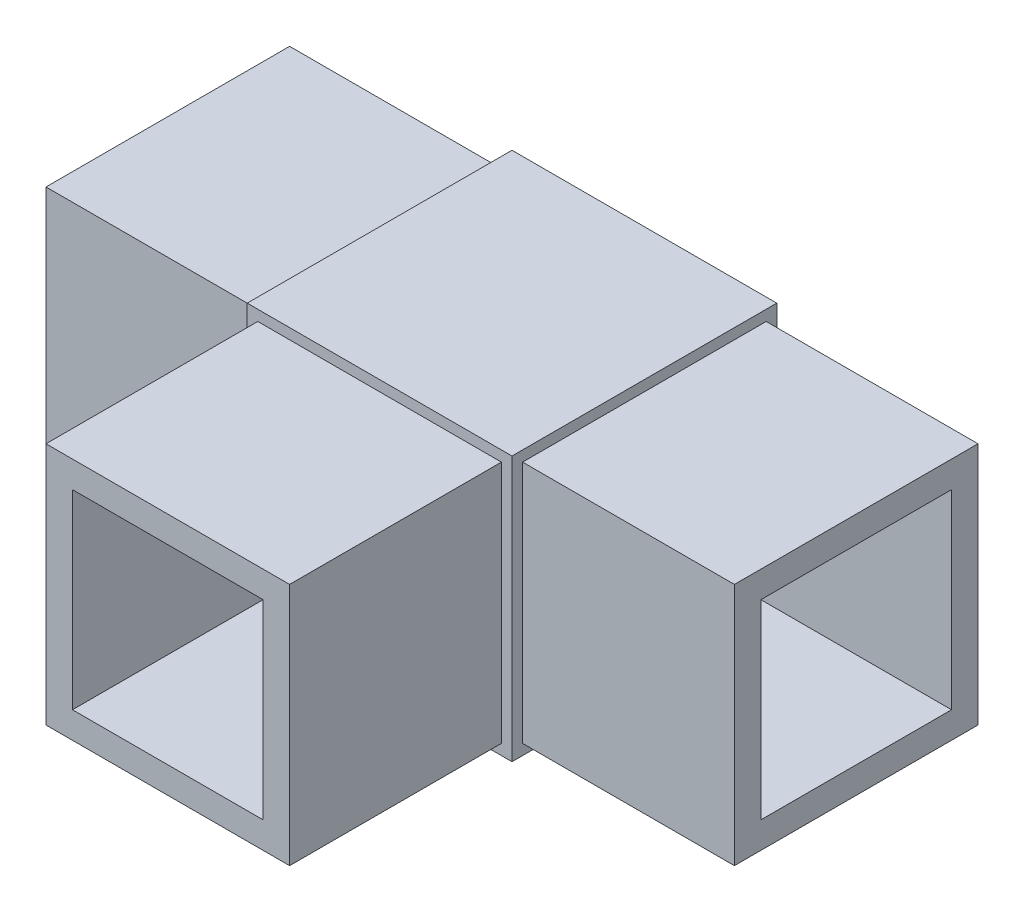
ISO-10303-21;
HEADER;
FILE_DESCRIPTION(('STEP AP214'),'2;1');
FILE_NAME('part.step','',(''),(''),'','','');
FILE_SCHEMA(('AUTOMOTIVE_DESIGN { 1 0 10303 214 1 1 1 1 }'));
ENDSEC;
DATA;
#1=APPLICATION_CONTEXT('core data for automotive mechanical design processes');
#2=APPLICATION_PROTOCOL_DEFINITION('international standard','automotive_design',2000,#1);
#3=PRODUCT_CONTEXT('',#1,'mechanical');
#4=PRODUCT('Part','Part','',(#3));
#5=PRODUCT_RELATED_PRODUCT_CATEGORY('part','',(#4));
#6=PRODUCT_DEFINITION_FORMATION('','',#4);
#7=PRODUCT_DEFINITION_CONTEXT('part definition',#1,'design');
#8=PRODUCT_DEFINITION('design','',#6,#7);
#9=PRODUCT_DEFINITION_SHAPE('','',#8);
#10=(LENGTH_UNIT() NAMED_UNIT(*) SI_UNIT(.MILLI.,.METRE.));
#11=(NAMED_UNIT(*) PLANE_ANGLE_UNIT() SI_UNIT($,.RADIAN.));
#12=(NAMED_UNIT(*) SI_UNIT($,.STERADIAN.) SOLID_ANGLE_UNIT());
#13=UNCERTAINTY_MEASURE_WITH_UNIT(LENGTH_MEASURE(1.E-05),#10,'distance_accuracy_value','');
#14=(GEOMETRIC_REPRESENTATION_CONTEXT(3) GLOBAL_UNCERTAINTY_ASSIGNED_CONTEXT((#13)) GLOBAL_UNIT_ASSIGNED_CONTEXT((#10,
#11,#12)) REPRESENTATION_CONTEXT('',''));
#15=CARTESIAN_POINT('',(0.,0.,0.));
#16=DIRECTION('',(0.,0.,1.));
#17=DIRECTION('',(1.,0.,0.));
#18=AXIS2_PLACEMENT_3D('',#15,#16,#17);
#19=CARTESIAN_POINT('',(109.11923894657,-205.969874038202,21.5));
#20=DIRECTION('',(0.,0.,1.));
#21=DIRECTION('',(1.,0.,0.));
#22=AXIS2_PLACEMENT_3D('',#19,#20,#21);
#23=PLANE('',#22);
#24=DIRECTION('',(1.,0.,0.));
#25=VECTOR('',#24,1.);
#26=CARTESIAN_POINT('',(109.11923894657,-187.969874038202,21.5));
#27=LINE('',#26,#25);
#28=CARTESIAN_POINT('',(109.11923894657,-187.969874038202,21.5));
#29=VERTEX_POINT('',#28);
#30=CARTESIAN_POINT('',(132.61923894657,-187.969874038202,21.5));
#31=VERTEX_POINT('',#30);
#32=EDGE_CURVE('E261',#29,#31,#27,.T.);
#33=ORIENTED_EDGE('',*,*,#32,.T.);
#34=DIRECTION('',(0.,-1.,0.));
#35=VECTOR('',#34,1.);
#36=CARTESIAN_POINT('',(132.61923894657,-205.969874038202,21.5));
#37=LINE('',#36,#35);
#38=CARTESIAN_POINT('',(132.61923894657,-205.969874038202,21.5));
#39=VERTEX_POINT('',#38);
#40=EDGE_CURVE('E230',#31,#39,#37,.T.);
#41=ORIENTED_EDGE('',*,*,#40,.T.);
#42=DIRECTION('',(1.,0.,0.));
#43=VECTOR('',#42,1.);
#44=CARTESIAN_POINT('',(109.11923894657,-205.969874038202,21.5));
#45=LINE('',#44,#43);
#46=CARTESIAN_POINT('',(109.11923894657,-205.969874038202,21.5));
#47=VERTEX_POINT('',#46);
#48=EDGE_CURVE('E202',#47,#39,#45,.T.);
#49=ORIENTED_EDGE('',*,*,#48,.F.);
#50=DIRECTION('',(0.,-1.,0.));
#51=VECTOR('',#50,1.);
#52=CARTESIAN_POINT('',(109.11923894657,-205.969874038202,21.5));
#53=LINE('',#52,#51);
#54=EDGE_CURVE('E240',#29,#47,#53,.T.);
#55=ORIENTED_EDGE('',*,*,#54,.F.);
#56=EDGE_LOOP('',(#33,#41,#49,#55));
#57=FACE_BOUND('',#56,.T.);
#58=ADVANCED_FACE('F35',(#57),#23,.F.);
#59=CARTESIAN_POINT('',(109.11923894657,-209.469874038202,25.));
#60=DIRECTION('',(0.,1.,0.));
#61=DIRECTION('',(-1.,0.,0.));
#62=AXIS2_PLACEMENT_3D('',#59,#60,#61);
#63=PLANE('',#62);
#64=DIRECTION('',(0.,0.,-1.));
#65=VECTOR('',#64,1.);
#66=CARTESIAN_POINT('',(154.11923894657,-209.469874038202,0.));
#67=LINE('',#66,#65);
#68=CARTESIAN_POINT('',(154.11923894657,-209.469874038202,25.));
#69=VERTEX_POINT('',#68);
#70=CARTESIAN_POINT('',(154.11923894657,-209.469874038202,0.));
#71=VERTEX_POINT('',#70);
#72=EDGE_CURVE('E304',#69,#71,#67,.T.);
#73=ORIENTED_EDGE('',*,*,#72,.F.);
#74=DIRECTION('',(1.,0.,0.));
#75=VECTOR('',#74,1.);
#76=CARTESIAN_POINT('',(109.11923894657,-209.469874038202,25.));
#77=LINE('',#76,#75);
#78=CARTESIAN_POINT('',(129.11923894657,-209.469874038202,25.));
#79=VERTEX_POINT('',#78);
#80=EDGE_CURVE('E11',#79,#69,#77,.T.);
#81=ORIENTED_EDGE('',*,*,#80,.F.);
#82=DIRECTION('',(0.,0.,1.));
#83=VECTOR('',#82,1.);
#84=CARTESIAN_POINT('',(129.11923894657,-209.469874038202,0.));
#85=LINE('',#84,#83);
#86=CARTESIAN_POINT('',(129.11923894657,-209.469874038202,0.));
#87=VERTEX_POINT('',#86);
#88=EDGE_CURVE('E341',#87,#79,#85,.T.);
#89=ORIENTED_EDGE('',*,*,#88,.F.);
#90=DIRECTION('',(1.,0.,0.));
#91=VECTOR('',#90,1.);
#92=CARTESIAN_POINT('',(109.11923894657,-209.469874038202,0.));
#93=LINE('',#92,#91);
#94=EDGE_CURVE('E39',#87,#71,#93,.T.);
#95=ORIENTED_EDGE('',*,*,#94,.T.);
#96=EDGE_LOOP('',(#73,#81,#89,#95));
#97=FACE_BOUND('',#96,.T.);
#98=ADVANCED_FACE('F392',(#97),#63,.F.);
#99=CARTESIAN_POINT('',(109.11923894657,-184.469874038202,25.));
#100=DIRECTION('',(0.,1.,0.));
#101=DIRECTION('',(0.,0.,1.));
#102=AXIS2_PLACEMENT_3D('',#99,#100,#101);
#103=PLANE('',#102);
#104=DIRECTION('',(1.,0.,0.));
#105=VECTOR('',#104,1.);
#106=CARTESIAN_POINT('',(109.11923894657,-184.469874038202,25.));
#107=LINE('',#106,#105);
#108=CARTESIAN_POINT('',(129.11923894657,-184.469874038202,25.));
#109=VERTEX_POINT('',#108);
#110=CARTESIAN_POINT('',(154.11923894657,-184.469874038202,25.));
#111=VERTEX_POINT('',#110);
#112=EDGE_CURVE('E44',#109,#111,#107,.T.);
#113=ORIENTED_EDGE('',*,*,#112,.T.);
#114=DIRECTION('',(0.,0.,1.));
#115=VECTOR('',#114,1.);
#116=CARTESIAN_POINT('',(154.11923894657,-184.469874038202,0.));
#117=LINE('',#116,#115);
#118=CARTESIAN_POINT('',(154.11923894657,-184.469874038202,0.));
#119=VERTEX_POINT('',#118);
#120=EDGE_CURVE('E300',#119,#111,#117,.T.);
#121=ORIENTED_EDGE('',*,*,#120,.F.);
#122=DIRECTION('',(1.,0.,0.));
#123=VECTOR('',#122,1.);
#124=CARTESIAN_POINT('',(109.11923894657,-184.469874038202,0.));
#125=LINE('',#124,#123);
#126=CARTESIAN_POINT('',(129.11923894657,-184.469874038202,0.));
#127=VERTEX_POINT('',#126);
#128=EDGE_CURVE('E374',#127,#119,#125,.T.);
#129=ORIENTED_EDGE('',*,*,#128,.F.);
#130=DIRECTION('',(0.,0.,-1.));
#131=VECTOR('',#130,1.);
#132=CARTESIAN_POINT('',(129.11923894657,-184.469874038202,0.));
#133=LINE('',#132,#131);
#134=EDGE_CURVE('E345',#109,#127,#133,.T.);
#135=ORIENTED_EDGE('',*,*,#134,.F.);
#136=EDGE_LOOP('',(#113,#121,#129,#135));
#137=FACE_BOUND('',#136,.T.);
#138=ADVANCED_FACE('F400',(#137),#103,.T.);
#139=CARTESIAN_POINT('',(0.,0.,25.));
#140=DIRECTION('',(0.,0.,-1.));
#141=DIRECTION('',(-1.,0.,0.));
#142=AXIS2_PLACEMENT_3D('',#139,#140,#141);
#143=PLANE('',#142);
#144=DIRECTION('',(0.,-1.,0.));
#145=VECTOR('',#144,1.);
#146=CARTESIAN_POINT('',(130.11923894657,-208.469874038202,25.));
#147=LINE('',#146,#145);
#148=CARTESIAN_POINT('',(130.11923894657,-185.469874038202,25.));
#149=VERTEX_POINT('',#148);
#150=CARTESIAN_POINT('',(130.11923894657,-208.469874038202,25.));
#151=VERTEX_POINT('',#150);
#152=EDGE_CURVE('E348',#149,#151,#147,.T.);
#153=ORIENTED_EDGE('',*,*,#152,.F.);
#154=DIRECTION('',(-1.,0.,0.));
#155=VECTOR('',#154,1.);
#156=CARTESIAN_POINT('',(130.11923894657,-185.469874038202,25.));
#157=LINE('',#156,#155);
#158=CARTESIAN_POINT('',(153.11923894657,-185.469874038202,25.));
#159=VERTEX_POINT('',#158);
#160=EDGE_CURVE('E358',#159,#149,#157,.T.);
#161=ORIENTED_EDGE('',*,*,#160,.F.);
#162=DIRECTION('',(0.,1.,0.));
#163=VECTOR('',#162,1.);
#164=CARTESIAN_POINT('',(153.11923894657,-208.469874038202,25.));
#165=LINE('',#164,#163);
#166=CARTESIAN_POINT('',(153.11923894657,-208.469874038202,25.));
#167=VERTEX_POINT('',#166);
#168=EDGE_CURVE('E355',#167,#159,#165,.T.);
#169=ORIENTED_EDGE('',*,*,#168,.F.);
#170=DIRECTION('',(1.,0.,0.));
#171=VECTOR('',#170,1.);
#172=CARTESIAN_POINT('',(130.11923894657,-208.469874038202,25.));
#173=LINE('',#172,#171);
#174=EDGE_CURVE('E351',#151,#167,#173,.T.);
#175=ORIENTED_EDGE('',*,*,#174,.F.);
#176=EDGE_LOOP('',(#153,#161,#169,#175));
#177=FACE_BOUND('',#176,.T.);
#178=DIRECTION('',(0.,-1.,0.));
#179=VECTOR('',#178,1.);
#180=CARTESIAN_POINT('',(154.11923894657,-209.469874038202,25.));
#181=LINE('',#180,#179);
#182=EDGE_CURVE('E302',#111,#69,#181,.T.);
#183=ORIENTED_EDGE('',*,*,#182,.F.);
#184=ORIENTED_EDGE('',*,*,#112,.F.);
#185=DIRECTION('',(0.,1.,0.));
#186=VECTOR('',#185,1.);
#187=CARTESIAN_POINT('',(129.11923894657,-209.469874038202,25.));
#188=LINE('',#187,#186);
#189=EDGE_CURVE('E343',#79,#109,#188,.T.);
#190=ORIENTED_EDGE('',*,*,#189,.F.);
#191=ORIENTED_EDGE('',*,*,#80,.T.);
#192=EDGE_LOOP('',(#183,#184,#190,#191));
#193=FACE_BOUND('',#192,.T.);
#194=ADVANCED_FACE('F405',(#177,#193),#143,.F.);
#195=CARTESIAN_POINT('',(0.,0.,0.));
#196=DIRECTION('',(0.,0.,-1.));
#197=DIRECTION('',(-1.,0.,0.));
#198=AXIS2_PLACEMENT_3D('',#195,#196,#197);
#199=PLANE('',#198);
#200=ORIENTED_EDGE('',*,*,#128,.T.);
#201=DIRECTION('',(0.,1.,0.));
#202=VECTOR('',#201,1.);
#203=CARTESIAN_POINT('',(154.11923894657,-209.469874038202,0.));
#204=LINE('',#203,#202);
#205=EDGE_CURVE('E292',#71,#119,#204,.T.);
#206=ORIENTED_EDGE('',*,*,#205,.F.);
#207=ORIENTED_EDGE('',*,*,#94,.F.);
#208=DIRECTION('',(0.,-1.,0.));
#209=VECTOR('',#208,1.);
#210=CARTESIAN_POINT('',(129.11923894657,-209.469874038202,0.));
#211=LINE('',#210,#209);
#212=EDGE_CURVE('E333',#127,#87,#211,.T.);
#213=ORIENTED_EDGE('',*,*,#212,.F.);
#214=EDGE_LOOP('',(#200,#206,#207,#213));
#215=FACE_BOUND('',#214,.T.);
#216=ADVANCED_FACE('F394',(#215),#199,.T.);
#217=CARTESIAN_POINT('',(130.11923894657,-208.469874038202,25.));
#218=DIRECTION('',(-1.,0.,0.));
#219=DIRECTION('',(0.,0.,1.));
#220=AXIS2_PLACEMENT_3D('',#217,#218,#219);
#221=PLANE('',#220);
#222=DIRECTION('',(0.,-1.,0.));
#223=VECTOR('',#222,1.);
#224=CARTESIAN_POINT('',(130.11923894657,-208.469874038202,45.));
#225=LINE('',#224,#223);
#226=CARTESIAN_POINT('',(130.11923894657,-185.469874038202,45.));
#227=VERTEX_POINT('',#226);
#228=CARTESIAN_POINT('',(130.11923894657,-208.469874038202,45.));
#229=VERTEX_POINT('',#228);
#230=EDGE_CURVE('E347',#227,#229,#225,.T.);
#231=ORIENTED_EDGE('',*,*,#230,.F.);
#232=DIRECTION('',(0.,0.,1.));
#233=VECTOR('',#232,1.);
#234=CARTESIAN_POINT('',(130.11923894657,-185.469874038202,25.));
#235=LINE('',#234,#233);
#236=EDGE_CURVE('E372',#149,#227,#235,.T.);
#237=ORIENTED_EDGE('',*,*,#236,.F.);
#238=ORIENTED_EDGE('',*,*,#152,.T.);
#239=DIRECTION('',(0.,0.,1.));
#240=VECTOR('',#239,1.);
#241=CARTESIAN_POINT('',(130.11923894657,-208.469874038202,25.));
#242=LINE('',#241,#240);
#243=EDGE_CURVE('E361',#151,#229,#242,.T.);
#244=ORIENTED_EDGE('',*,*,#243,.T.);
#245=EDGE_LOOP('',(#231,#237,#238,#244));
#246=FACE_BOUND('',#245,.T.);
#247=ADVANCED_FACE('F515',(#246),#221,.T.);
#248=CARTESIAN_POINT('',(130.11923894657,-185.469874038202,25.));
#249=DIRECTION('',(0.,1.,0.));
#250=DIRECTION('',(0.,0.,1.));
#251=AXIS2_PLACEMENT_3D('',#248,#249,#250);
#252=PLANE('',#251);
#253=DIRECTION('',(-1.,0.,0.));
#254=VECTOR('',#253,1.);
#255=CARTESIAN_POINT('',(130.11923894657,-185.469874038202,45.));
#256=LINE('',#255,#254);
#257=CARTESIAN_POINT('',(153.11923894657,-185.469874038202,45.));
#258=VERTEX_POINT('',#257);
#259=EDGE_CURVE('E352',#258,#227,#256,.T.);
#260=ORIENTED_EDGE('',*,*,#259,.F.);
#261=DIRECTION('',(0.,0.,1.));
#262=VECTOR('',#261,1.);
#263=CARTESIAN_POINT('',(153.11923894657,-185.469874038202,25.));
#264=LINE('',#263,#262);
#265=EDGE_CURVE('E375',#159,#258,#264,.T.);
#266=ORIENTED_EDGE('',*,*,#265,.F.);
#267=ORIENTED_EDGE('',*,*,#160,.T.);
#268=ORIENTED_EDGE('',*,*,#236,.T.);
#269=EDGE_LOOP('',(#260,#266,#267,#268));
#270=FACE_BOUND('',#269,.T.);
#271=ADVANCED_FACE('F520',(#270),#252,.T.);
#272=CARTESIAN_POINT('',(153.11923894657,-208.469874038202,25.));
#273=DIRECTION('',(1.,0.,0.));
#274=DIRECTION('',(0.,0.,-1.));
#275=AXIS2_PLACEMENT_3D('',#272,#273,#274);
#276=PLANE('',#275);
#277=DIRECTION('',(0.,1.,0.));
#278=VECTOR('',#277,1.);
#279=CARTESIAN_POINT('',(153.11923894657,-208.469874038202,45.));
#280=LINE('',#279,#278);
#281=CARTESIAN_POINT('',(153.11923894657,-208.469874038202,45.));
#282=VERTEX_POINT('',#281);
#283=EDGE_CURVE('E367',#282,#258,#280,.T.);
#284=ORIENTED_EDGE('',*,*,#283,.F.);
#285=DIRECTION('',(0.,0.,1.));
#286=VECTOR('',#285,1.);
#287=CARTESIAN_POINT('',(153.11923894657,-208.469874038202,25.));
#288=LINE('',#287,#286);
#289=EDGE_CURVE('E377',#167,#282,#288,.T.);
#290=ORIENTED_EDGE('',*,*,#289,.F.);
#291=ORIENTED_EDGE('',*,*,#168,.T.);
#292=ORIENTED_EDGE('',*,*,#265,.T.);
#293=EDGE_LOOP('',(#284,#290,#291,#292));
#294=FACE_BOUND('',#293,.T.);
#295=ADVANCED_FACE('F524',(#294),#276,.T.);
#296=CARTESIAN_POINT('',(130.11923894657,-208.469874038202,25.));
#297=DIRECTION('',(0.,-1.,0.));
#298=DIRECTION('',(0.,0.,-1.));
#299=AXIS2_PLACEMENT_3D('',#296,#297,#298);
#300=PLANE('',#299);
#301=DIRECTION('',(1.,0.,0.));
#302=VECTOR('',#301,1.);
#303=CARTESIAN_POINT('',(130.11923894657,-208.469874038202,45.));
#304=LINE('',#303,#302);
#305=EDGE_CURVE('E364',#229,#282,#304,.T.);
#306=ORIENTED_EDGE('',*,*,#305,.F.);
#307=ORIENTED_EDGE('',*,*,#243,.F.);
#308=ORIENTED_EDGE('',*,*,#174,.T.);
#309=ORIENTED_EDGE('',*,*,#289,.T.);
#310=EDGE_LOOP('',(#306,#307,#308,#309));
#311=FACE_BOUND('',#310,.T.);
#312=ADVANCED_FACE('F419',(#311),#300,.T.);
#313=CARTESIAN_POINT('',(0.,0.,45.));
#314=DIRECTION('',(0.,0.,1.));
#315=DIRECTION('',(1.,0.,0.));
#316=AXIS2_PLACEMENT_3D('',#313,#314,#315);
#317=PLANE('',#316);
#318=DIRECTION('',(-1.,0.,0.));
#319=VECTOR('',#318,1.);
#320=CARTESIAN_POINT('',(150.61923894657,-187.969874038202,45.));
#321=LINE('',#320,#319);
#322=CARTESIAN_POINT('',(150.61923894657,-187.969874038202,45.));
#323=VERTEX_POINT('',#322);
#324=CARTESIAN_POINT('',(132.61923894657,-187.969874038202,45.));
#325=VERTEX_POINT('',#324);
#326=EDGE_CURVE('E215',#323,#325,#321,.T.);
#327=ORIENTED_EDGE('',*,*,#326,.F.);
#328=DIRECTION('',(0.,1.,0.));
#329=VECTOR('',#328,1.);
#330=CARTESIAN_POINT('',(150.61923894657,-205.969874038202,45.));
#331=LINE('',#330,#329);
#332=CARTESIAN_POINT('',(150.61923894657,-205.969874038202,45.));
#333=VERTEX_POINT('',#332);
#334=EDGE_CURVE('E220',#333,#323,#331,.T.);
#335=ORIENTED_EDGE('',*,*,#334,.F.);
#336=DIRECTION('',(1.,0.,0.));
#337=VECTOR('',#336,1.);
#338=CARTESIAN_POINT('',(150.61923894657,-205.969874038202,45.));
#339=LINE('',#338,#337);
#340=CARTESIAN_POINT('',(132.61923894657,-205.969874038202,45.));
#341=VERTEX_POINT('',#340);
#342=EDGE_CURVE('E52',#341,#333,#339,.T.);
#343=ORIENTED_EDGE('',*,*,#342,.F.);
#344=DIRECTION('',(0.,-1.,0.));
#345=VECTOR('',#344,1.);
#346=CARTESIAN_POINT('',(132.61923894657,-205.969874038202,45.));
#347=LINE('',#346,#345);
#348=EDGE_CURVE('E209',#325,#341,#347,.T.);
#349=ORIENTED_EDGE('',*,*,#348,.F.);
#350=EDGE_LOOP('',(#327,#335,#343,#349));
#351=FACE_BOUND('',#350,.T.);
#352=ORIENTED_EDGE('',*,*,#259,.T.);
#353=ORIENTED_EDGE('',*,*,#230,.T.);
#354=ORIENTED_EDGE('',*,*,#305,.T.);
#355=ORIENTED_EDGE('',*,*,#283,.T.);
#356=EDGE_LOOP('',(#352,#353,#354,#355));
#357=FACE_BOUND('',#356,.T.);
#358=ADVANCED_FACE('F218',(#351,#357),#317,.T.);
#359=CARTESIAN_POINT('',(129.11923894657,0.,0.));
#360=DIRECTION('',(1.,0.,0.));
#361=DIRECTION('',(0.,0.,-1.));
#362=AXIS2_PLACEMENT_3D('',#359,#360,#361);
#363=PLANE('',#362);
#364=DIRECTION('',(0.,-1.,0.));
#365=VECTOR('',#364,1.);
#366=CARTESIAN_POINT('',(129.11923894657,-208.469874038202,1.));
#367=LINE('',#366,#365);
#368=CARTESIAN_POINT('',(129.11923894657,-185.469874038202,1.));
#369=VERTEX_POINT('',#368);
#370=CARTESIAN_POINT('',(129.11923894657,-208.469874038202,1.));
#371=VERTEX_POINT('',#370);
#372=EDGE_CURVE('E307',#369,#371,#367,.T.);
#373=ORIENTED_EDGE('',*,*,#372,.F.);
#374=DIRECTION('',(0.,0.,-1.));
#375=VECTOR('',#374,1.);
#376=CARTESIAN_POINT('',(129.11923894657,-185.469874038202,1.));
#377=LINE('',#376,#375);
#378=CARTESIAN_POINT('',(129.11923894657,-185.469874038202,24.));
#379=VERTEX_POINT('',#378);
#380=EDGE_CURVE('E317',#379,#369,#377,.T.);
#381=ORIENTED_EDGE('',*,*,#380,.F.);
#382=DIRECTION('',(0.,1.,0.));
#383=VECTOR('',#382,1.);
#384=CARTESIAN_POINT('',(129.11923894657,-208.469874038202,24.));
#385=LINE('',#384,#383);
#386=CARTESIAN_POINT('',(129.11923894657,-208.469874038202,24.));
#387=VERTEX_POINT('',#386);
#388=EDGE_CURVE('E314',#387,#379,#385,.T.);
#389=ORIENTED_EDGE('',*,*,#388,.F.);
#390=DIRECTION('',(0.,0.,1.));
#391=VECTOR('',#390,1.);
#392=CARTESIAN_POINT('',(129.11923894657,-208.469874038202,1.));
#393=LINE('',#392,#391);
#394=EDGE_CURVE('E310',#371,#387,#393,.T.);
#395=ORIENTED_EDGE('',*,*,#394,.F.);
#396=EDGE_LOOP('',(#373,#381,#389,#395));
#397=FACE_BOUND('',#396,.T.);
#398=ORIENTED_EDGE('',*,*,#212,.T.);
#399=ORIENTED_EDGE('',*,*,#88,.T.);
#400=ORIENTED_EDGE('',*,*,#189,.T.);
#401=ORIENTED_EDGE('',*,*,#134,.T.);
#402=EDGE_LOOP('',(#398,#399,#400,#401));
#403=FACE_BOUND('',#402,.T.);
#404=ADVANCED_FACE('F407',(#397,#403),#363,.F.);
#405=CARTESIAN_POINT('',(129.11923894657,-208.469874038202,1.));
#406=DIRECTION('',(0.,0.,-1.));
#407=DIRECTION('',(-1.,0.,0.));
#408=AXIS2_PLACEMENT_3D('',#405,#406,#407);
#409=PLANE('',#408);
#410=DIRECTION('',(0.,-1.,0.));
#411=VECTOR('',#410,1.);
#412=CARTESIAN_POINT('',(109.11923894657,-208.469874038202,1.));
#413=LINE('',#412,#411);
#414=CARTESIAN_POINT('',(109.11923894657,-185.469874038202,1.));
#415=VERTEX_POINT('',#414);
#416=CARTESIAN_POINT('',(109.11923894657,-208.469874038202,1.));
#417=VERTEX_POINT('',#416);
#418=EDGE_CURVE('E306',#415,#417,#413,.T.);
#419=ORIENTED_EDGE('',*,*,#418,.F.);
#420=DIRECTION('',(-1.,0.,0.));
#421=VECTOR('',#420,1.);
#422=CARTESIAN_POINT('',(129.11923894657,-185.469874038202,1.));
#423=LINE('',#422,#421);
#424=EDGE_CURVE('E331',#369,#415,#423,.T.);
#425=ORIENTED_EDGE('',*,*,#424,.F.);
#426=ORIENTED_EDGE('',*,*,#372,.T.);
#427=DIRECTION('',(-1.,0.,0.));
#428=VECTOR('',#427,1.);
#429=CARTESIAN_POINT('',(129.11923894657,-208.469874038202,1.));
#430=LINE('',#429,#428);
#431=EDGE_CURVE('E320',#371,#417,#430,.T.);
#432=ORIENTED_EDGE('',*,*,#431,.T.);
#433=EDGE_LOOP('',(#419,#425,#426,#432));
#434=FACE_BOUND('',#433,.T.);
#435=ADVANCED_FACE('F409',(#434),#409,.T.);
#436=CARTESIAN_POINT('',(129.11923894657,-185.469874038202,1.));
#437=DIRECTION('',(0.,1.,0.));
#438=DIRECTION('',(0.,0.,1.));
#439=AXIS2_PLACEMENT_3D('',#436,#437,#438);
#440=PLANE('',#439);
#441=DIRECTION('',(0.,0.,-1.));
#442=VECTOR('',#441,1.);
#443=CARTESIAN_POINT('',(109.11923894657,-185.469874038202,1.));
#444=LINE('',#443,#442);
#445=CARTESIAN_POINT('',(109.11923894657,-185.469874038202,24.));
#446=VERTEX_POINT('',#445);
#447=EDGE_CURVE('E311',#446,#415,#444,.T.);
#448=ORIENTED_EDGE('',*,*,#447,.F.);
#449=DIRECTION('',(-1.,0.,0.));
#450=VECTOR('',#449,1.);
#451=CARTESIAN_POINT('',(129.11923894657,-185.469874038202,24.));
#452=LINE('',#451,#450);
#453=EDGE_CURVE('E334',#379,#446,#452,.T.);
#454=ORIENTED_EDGE('',*,*,#453,.F.);
#455=ORIENTED_EDGE('',*,*,#380,.T.);
#456=ORIENTED_EDGE('',*,*,#424,.T.);
#457=EDGE_LOOP('',(#448,#454,#455,#456));
#458=FACE_BOUND('',#457,.T.);
#459=ADVANCED_FACE('F416',(#458),#440,.T.);
#460=CARTESIAN_POINT('',(129.11923894657,-208.469874038202,24.));
#461=DIRECTION('',(0.,0.,1.));
#462=DIRECTION('',(1.,0.,0.));
#463=AXIS2_PLACEMENT_3D('',#460,#461,#462);
#464=PLANE('',#463);
#465=DIRECTION('',(0.,1.,0.));
#466=VECTOR('',#465,1.);
#467=CARTESIAN_POINT('',(109.11923894657,-208.469874038202,24.));
#468=LINE('',#467,#466);
#469=CARTESIAN_POINT('',(109.11923894657,-208.469874038202,24.));
#470=VERTEX_POINT('',#469);
#471=EDGE_CURVE('E326',#470,#446,#468,.T.);
#472=ORIENTED_EDGE('',*,*,#471,.F.);
#473=DIRECTION('',(-1.,0.,0.));
#474=VECTOR('',#473,1.);
#475=CARTESIAN_POINT('',(129.11923894657,-208.469874038202,24.));
#476=LINE('',#475,#474);
#477=EDGE_CURVE('E336',#387,#470,#476,.T.);
#478=ORIENTED_EDGE('',*,*,#477,.F.);
#479=ORIENTED_EDGE('',*,*,#388,.T.);
#480=ORIENTED_EDGE('',*,*,#453,.T.);
#481=EDGE_LOOP('',(#472,#478,#479,#480));
#482=FACE_BOUND('',#481,.T.);
#483=ADVANCED_FACE('F469',(#482),#464,.T.);
#484=CARTESIAN_POINT('',(129.11923894657,-208.469874038202,1.));
#485=DIRECTION('',(0.,-1.,0.));
#486=DIRECTION('',(0.,0.,-1.));
#487=AXIS2_PLACEMENT_3D('',#484,#485,#486);
#488=PLANE('',#487);
#489=DIRECTION('',(0.,0.,1.));
#490=VECTOR('',#489,1.);
#491=CARTESIAN_POINT('',(109.11923894657,-208.469874038202,1.));
#492=LINE('',#491,#490);
#493=EDGE_CURVE('E323',#417,#470,#492,.T.);
#494=ORIENTED_EDGE('',*,*,#493,.F.);
#495=ORIENTED_EDGE('',*,*,#431,.F.);
#496=ORIENTED_EDGE('',*,*,#394,.T.);
#497=ORIENTED_EDGE('',*,*,#477,.T.);
#498=EDGE_LOOP('',(#494,#495,#496,#497));
#499=FACE_BOUND('',#498,.T.);
#500=ADVANCED_FACE('F459',(#499),#488,.T.);
#501=CARTESIAN_POINT('',(109.11923894657,-209.469874038202,25.));
#502=DIRECTION('',(-1.,0.,0.));
#503=DIRECTION('',(0.,0.,1.));
#504=AXIS2_PLACEMENT_3D('',#501,#502,#503);
#505=PLANE('',#504);
#506=DIRECTION('',(0.,1.,0.));
#507=VECTOR('',#506,1.);
#508=CARTESIAN_POINT('',(109.11923894657,-205.969874038202,3.5));
#509=LINE('',#508,#507);
#510=CARTESIAN_POINT('',(109.11923894657,-205.969874038202,3.5));
#511=VERTEX_POINT('',#510);
#512=CARTESIAN_POINT('',(109.11923894657,-187.969874038202,3.5));
#513=VERTEX_POINT('',#512);
#514=EDGE_CURVE('E233',#511,#513,#509,.T.);
#515=ORIENTED_EDGE('',*,*,#514,.T.);
#516=DIRECTION('',(0.,0.,1.));
#517=VECTOR('',#516,1.);
#518=CARTESIAN_POINT('',(109.11923894657,-187.969874038202,3.5));
#519=LINE('',#518,#517);
#520=EDGE_CURVE('E236',#513,#29,#519,.T.);
#521=ORIENTED_EDGE('',*,*,#520,.T.);
#522=ORIENTED_EDGE('',*,*,#54,.T.);
#523=DIRECTION('',(0.,0.,-1.));
#524=VECTOR('',#523,1.);
#525=CARTESIAN_POINT('',(109.11923894657,-205.969874038202,3.5));
#526=LINE('',#525,#524);
#527=EDGE_CURVE('E243',#47,#511,#526,.T.);
#528=ORIENTED_EDGE('',*,*,#527,.T.);
#529=EDGE_LOOP('',(#515,#521,#522,#528));
#530=FACE_BOUND('',#529,.T.);
#531=ORIENTED_EDGE('',*,*,#447,.T.);
#532=ORIENTED_EDGE('',*,*,#418,.T.);
#533=ORIENTED_EDGE('',*,*,#493,.T.);
#534=ORIENTED_EDGE('',*,*,#471,.T.);
#535=EDGE_LOOP('',(#531,#532,#533,#534));
#536=FACE_BOUND('',#535,.T.);
#537=ADVANCED_FACE('F37',(#530,#536),#505,.T.);
#538=CARTESIAN_POINT('',(154.11923894657,0.,0.));
#539=DIRECTION('',(1.,0.,0.));
#540=DIRECTION('',(0.,0.,-1.));
#541=AXIS2_PLACEMENT_3D('',#538,#539,#540);
#542=PLANE('',#541);
#543=DIRECTION('',(0.,0.,-1.));
#544=VECTOR('',#543,1.);
#545=CARTESIAN_POINT('',(154.11923894657,-208.469874038202,1.));
#546=LINE('',#545,#544);
#547=CARTESIAN_POINT('',(154.11923894657,-208.469874038202,24.));
#548=VERTEX_POINT('',#547);
#549=CARTESIAN_POINT('',(154.11923894657,-208.469874038202,1.));
#550=VERTEX_POINT('',#549);
#551=EDGE_CURVE('E276',#548,#550,#546,.T.);
#552=ORIENTED_EDGE('',*,*,#551,.F.);
#553=DIRECTION('',(0.,-1.,0.));
#554=VECTOR('',#553,1.);
#555=CARTESIAN_POINT('',(154.11923894657,-208.469874038202,24.));
#556=LINE('',#555,#554);
#557=CARTESIAN_POINT('',(154.11923894657,-185.469874038202,24.));
#558=VERTEX_POINT('',#557);
#559=EDGE_CURVE('E273',#558,#548,#556,.T.);
#560=ORIENTED_EDGE('',*,*,#559,.F.);
#561=DIRECTION('',(0.,0.,1.));
#562=VECTOR('',#561,1.);
#563=CARTESIAN_POINT('',(154.11923894657,-185.469874038202,1.));
#564=LINE('',#563,#562);
#565=CARTESIAN_POINT('',(154.11923894657,-185.469874038202,1.));
#566=VERTEX_POINT('',#565);
#567=EDGE_CURVE('E269',#566,#558,#564,.T.);
#568=ORIENTED_EDGE('',*,*,#567,.F.);
#569=DIRECTION('',(0.,1.,0.));
#570=VECTOR('',#569,1.);
#571=CARTESIAN_POINT('',(154.11923894657,-208.469874038202,1.));
#572=LINE('',#571,#570);
#573=EDGE_CURVE('E266',#550,#566,#572,.T.);
#574=ORIENTED_EDGE('',*,*,#573,.F.);
#575=EDGE_LOOP('',(#552,#560,#568,#574));
#576=FACE_BOUND('',#575,.T.);
#577=ORIENTED_EDGE('',*,*,#205,.T.);
#578=ORIENTED_EDGE('',*,*,#120,.T.);
#579=ORIENTED_EDGE('',*,*,#182,.T.);
#580=ORIENTED_EDGE('',*,*,#72,.T.);
#581=EDGE_LOOP('',(#577,#578,#579,#580));
#582=FACE_BOUND('',#581,.T.);
#583=ADVANCED_FACE('F397',(#576,#582),#542,.T.);
#584=CARTESIAN_POINT('',(154.11923894657,-208.469874038202,1.));
#585=DIRECTION('',(0.,0.,-1.));
#586=DIRECTION('',(-1.,0.,0.));
#587=AXIS2_PLACEMENT_3D('',#584,#585,#586);
#588=PLANE('',#587);
#589=DIRECTION('',(0.,1.,0.));
#590=VECTOR('',#589,1.);
#591=CARTESIAN_POINT('',(174.11923894657,-208.469874038202,1.));
#592=LINE('',#591,#590);
#593=CARTESIAN_POINT('',(174.11923894657,-208.469874038202,1.));
#594=VERTEX_POINT('',#593);
#595=CARTESIAN_POINT('',(174.11923894657,-185.469874038202,1.));
#596=VERTEX_POINT('',#595);
#597=EDGE_CURVE('E258',#594,#596,#592,.T.);
#598=ORIENTED_EDGE('',*,*,#597,.F.);
#599=DIRECTION('',(1.,0.,0.));
#600=VECTOR('',#599,1.);
#601=CARTESIAN_POINT('',(154.11923894657,-208.469874038202,1.));
#602=LINE('',#601,#600);
#603=EDGE_CURVE('E290',#550,#594,#602,.T.);
#604=ORIENTED_EDGE('',*,*,#603,.F.);
#605=ORIENTED_EDGE('',*,*,#573,.T.);
#606=DIRECTION('',(1.,0.,0.));
#607=VECTOR('',#606,1.);
#608=CARTESIAN_POINT('',(154.11923894657,-185.469874038202,1.));
#609=LINE('',#608,#607);
#610=EDGE_CURVE('E279',#566,#596,#609,.T.);
#611=ORIENTED_EDGE('',*,*,#610,.T.);
#612=EDGE_LOOP('',(#598,#604,#605,#611));
#613=FACE_BOUND('',#612,.T.);
#614=ADVANCED_FACE('F481',(#613),#588,.T.);
#615=CARTESIAN_POINT('',(154.11923894657,-208.469874038202,1.));
#616=DIRECTION('',(0.,-1.,0.));
#617=DIRECTION('',(0.,0.,-1.));
#618=AXIS2_PLACEMENT_3D('',#615,#616,#617);
#619=PLANE('',#618);
#620=DIRECTION('',(0.,0.,-1.));
#621=VECTOR('',#620,1.);
#622=CARTESIAN_POINT('',(174.11923894657,-208.469874038202,1.));
#623=LINE('',#622,#621);
#624=CARTESIAN_POINT('',(174.11923894657,-208.469874038202,24.));
#625=VERTEX_POINT('',#624);
#626=EDGE_CURVE('E270',#625,#594,#623,.T.);
#627=ORIENTED_EDGE('',*,*,#626,.F.);
#628=DIRECTION('',(1.,0.,0.));
#629=VECTOR('',#628,1.);
#630=CARTESIAN_POINT('',(154.11923894657,-208.469874038202,24.));
#631=LINE('',#630,#629);
#632=EDGE_CURVE('E293',#548,#625,#631,.T.);
#633=ORIENTED_EDGE('',*,*,#632,.F.);
#634=ORIENTED_EDGE('',*,*,#551,.T.);
#635=ORIENTED_EDGE('',*,*,#603,.T.);
#636=EDGE_LOOP('',(#627,#633,#634,#635));
#637=FACE_BOUND('',#636,.T.);
#638=ADVANCED_FACE('F485',(#637),#619,.T.);
#639=CARTESIAN_POINT('',(154.11923894657,-208.469874038202,24.));
#640=DIRECTION('',(0.,0.,1.));
#641=DIRECTION('',(1.,0.,0.));
#642=AXIS2_PLACEMENT_3D('',#639,#640,#641);
#643=PLANE('',#642);
#644=DIRECTION('',(0.,-1.,0.));
#645=VECTOR('',#644,1.);
#646=CARTESIAN_POINT('',(174.11923894657,-208.469874038202,24.));
#647=LINE('',#646,#645);
#648=CARTESIAN_POINT('',(174.11923894657,-185.469874038202,24.));
#649=VERTEX_POINT('',#648);
#650=EDGE_CURVE('E285',#649,#625,#647,.T.);
#651=ORIENTED_EDGE('',*,*,#650,.F.);
#652=DIRECTION('',(1.,0.,0.));
#653=VECTOR('',#652,1.);
#654=CARTESIAN_POINT('',(154.11923894657,-185.469874038202,24.));
#655=LINE('',#654,#653);
#656=EDGE_CURVE('E295',#558,#649,#655,.T.);
#657=ORIENTED_EDGE('',*,*,#656,.F.);
#658=ORIENTED_EDGE('',*,*,#559,.T.);
#659=ORIENTED_EDGE('',*,*,#632,.T.);
#660=EDGE_LOOP('',(#651,#657,#658,#659));
#661=FACE_BOUND('',#660,.T.);
#662=ADVANCED_FACE('F490',(#661),#643,.T.);
#663=CARTESIAN_POINT('',(154.11923894657,-185.469874038202,1.));
#664=DIRECTION('',(0.,1.,0.));
#665=DIRECTION('',(0.,0.,1.));
#666=AXIS2_PLACEMENT_3D('',#663,#664,#665);
#667=PLANE('',#666);
#668=DIRECTION('',(0.,0.,1.));
#669=VECTOR('',#668,1.);
#670=CARTESIAN_POINT('',(174.11923894657,-185.469874038202,1.));
#671=LINE('',#670,#669);
#672=EDGE_CURVE('E282',#596,#649,#671,.T.);
#673=ORIENTED_EDGE('',*,*,#672,.F.);
#674=ORIENTED_EDGE('',*,*,#610,.F.);
#675=ORIENTED_EDGE('',*,*,#567,.T.);
#676=ORIENTED_EDGE('',*,*,#656,.T.);
#677=EDGE_LOOP('',(#673,#674,#675,#676));
#678=FACE_BOUND('',#677,.T.);
#679=ADVANCED_FACE('F487',(#678),#667,.T.);
#680=CARTESIAN_POINT('',(174.11923894657,-209.469874038202,25.));
#681=DIRECTION('',(-1.,0.,0.));
#682=DIRECTION('',(0.,0.,1.));
#683=AXIS2_PLACEMENT_3D('',#680,#681,#682);
#684=PLANE('',#683);
#685=DIRECTION('',(0.,0.,1.));
#686=VECTOR('',#685,1.);
#687=CARTESIAN_POINT('',(174.11923894657,-187.969874038202,3.5));
#688=LINE('',#687,#686);
#689=CARTESIAN_POINT('',(174.11923894657,-187.969874038202,3.5));
#690=VERTEX_POINT('',#689);
#691=CARTESIAN_POINT('',(174.11923894657,-187.969874038202,21.5));
#692=VERTEX_POINT('',#691);
#693=EDGE_CURVE('E249',#690,#692,#688,.T.);
#694=ORIENTED_EDGE('',*,*,#693,.F.);
#695=DIRECTION('',(0.,1.,0.));
#696=VECTOR('',#695,1.);
#697=CARTESIAN_POINT('',(174.11923894657,-205.969874038202,3.5));
#698=LINE('',#697,#696);
#699=CARTESIAN_POINT('',(174.11923894657,-205.969874038202,3.5));
#700=VERTEX_POINT('',#699);
#701=EDGE_CURVE('E232',#700,#690,#698,.T.);
#702=ORIENTED_EDGE('',*,*,#701,.F.);
#703=DIRECTION('',(0.,0.,-1.));
#704=VECTOR('',#703,1.);
#705=CARTESIAN_POINT('',(174.11923894657,-205.969874038202,3.5));
#706=LINE('',#705,#704);
#707=CARTESIAN_POINT('',(174.11923894657,-205.969874038202,21.5));
#708=VERTEX_POINT('',#707);
#709=EDGE_CURVE('E237',#708,#700,#706,.T.);
#710=ORIENTED_EDGE('',*,*,#709,.F.);
#711=DIRECTION('',(0.,-1.,0.));
#712=VECTOR('',#711,1.);
#713=CARTESIAN_POINT('',(174.11923894657,-205.969874038202,21.5));
#714=LINE('',#713,#712);
#715=EDGE_CURVE('E252',#692,#708,#714,.T.);
#716=ORIENTED_EDGE('',*,*,#715,.F.);
#717=EDGE_LOOP('',(#694,#702,#710,#716));
#718=FACE_BOUND('',#717,.T.);
#719=ORIENTED_EDGE('',*,*,#597,.T.);
#720=ORIENTED_EDGE('',*,*,#672,.T.);
#721=ORIENTED_EDGE('',*,*,#650,.T.);
#722=ORIENTED_EDGE('',*,*,#626,.T.);
#723=EDGE_LOOP('',(#719,#720,#721,#722));
#724=FACE_BOUND('',#723,.T.);
#725=ADVANCED_FACE('F452',(#718,#724),#684,.F.);
#726=CARTESIAN_POINT('',(109.11923894657,-205.969874038202,3.5));
#727=DIRECTION('',(0.,0.,-1.));
#728=DIRECTION('',(0.,1.,0.));
#729=AXIS2_PLACEMENT_3D('',#726,#727,#728);
#730=PLANE('',#729);
#731=ORIENTED_EDGE('',*,*,#701,.T.);
#732=DIRECTION('',(1.,0.,0.));
#733=VECTOR('',#732,1.);
#734=CARTESIAN_POINT('',(109.11923894657,-187.969874038202,3.5));
#735=LINE('',#734,#733);
#736=EDGE_CURVE('E246',#513,#690,#735,.T.);
#737=ORIENTED_EDGE('',*,*,#736,.F.);
#738=ORIENTED_EDGE('',*,*,#514,.F.);
#739=DIRECTION('',(1.,0.,0.));
#740=VECTOR('',#739,1.);
#741=CARTESIAN_POINT('',(109.11923894657,-205.969874038202,3.5));
#742=LINE('',#741,#740);
#743=EDGE_CURVE('E256',#511,#700,#742,.T.);
#744=ORIENTED_EDGE('',*,*,#743,.T.);
#745=EDGE_LOOP('',(#731,#737,#738,#744));
#746=FACE_BOUND('',#745,.T.);
#747=ADVANCED_FACE('F441',(#746),#730,.F.);
#748=CARTESIAN_POINT('',(109.11923894657,-205.969874038202,3.5));
#749=DIRECTION('',(0.,-1.,0.));
#750=DIRECTION('',(0.,0.,-1.));
#751=AXIS2_PLACEMENT_3D('',#748,#749,#750);
#752=PLANE('',#751);
#753=ORIENTED_EDGE('',*,*,#709,.T.);
#754=ORIENTED_EDGE('',*,*,#743,.F.);
#755=ORIENTED_EDGE('',*,*,#527,.F.);
#756=ORIENTED_EDGE('',*,*,#48,.T.);
#757=DIRECTION('',(0.,0.,1.));
#758=VECTOR('',#757,1.);
#759=CARTESIAN_POINT('',(132.61923894657,-205.969874038202,-21.9558441227157));
#760=LINE('',#759,#758);
#761=EDGE_CURVE('E197',#39,#341,#760,.T.);
#762=ORIENTED_EDGE('',*,*,#761,.T.);
#763=ORIENTED_EDGE('',*,*,#342,.T.);
#764=DIRECTION('',(0.,0.,1.));
#765=VECTOR('',#764,1.);
#766=CARTESIAN_POINT('',(150.61923894657,-205.969874038202,-21.9558441227157));
#767=LINE('',#766,#765);
#768=CARTESIAN_POINT('',(150.61923894657,-205.969874038202,21.5));
#769=VERTEX_POINT('',#768);
#770=EDGE_CURVE('E205',#769,#333,#767,.T.);
#771=ORIENTED_EDGE('',*,*,#770,.F.);
#772=EDGE_CURVE('E260',#769,#708,#45,.T.);
#773=ORIENTED_EDGE('',*,*,#772,.T.);
#774=EDGE_LOOP('',(#753,#754,#755,#756,#762,#763,#771,#773));
#775=FACE_BOUND('',#774,.T.);
#776=ADVANCED_FACE('F200',(#775),#752,.F.);
#777=ORIENTED_EDGE('',*,*,#772,.F.);
#778=DIRECTION('',(0.,1.,0.));
#779=VECTOR('',#778,1.);
#780=CARTESIAN_POINT('',(150.61923894657,-205.969874038202,21.5));
#781=LINE('',#780,#779);
#782=CARTESIAN_POINT('',(150.61923894657,-187.969874038202,21.5));
#783=VERTEX_POINT('',#782);
#784=EDGE_CURVE('E228',#769,#783,#781,.T.);
#785=ORIENTED_EDGE('',*,*,#784,.T.);
#786=EDGE_CURVE('E264',#783,#692,#27,.T.);
#787=ORIENTED_EDGE('',*,*,#786,.T.);
#788=ORIENTED_EDGE('',*,*,#715,.T.);
#789=EDGE_LOOP('',(#777,#785,#787,#788));
#790=FACE_BOUND('',#789,.T.);
#791=ADVANCED_FACE('F426',(#790),#23,.F.);
#792=CARTESIAN_POINT('',(109.11923894657,-187.969874038202,3.5));
#793=DIRECTION('',(0.,1.,0.));
#794=DIRECTION('',(0.,0.,1.));
#795=AXIS2_PLACEMENT_3D('',#792,#793,#794);
#796=PLANE('',#795);
#797=ORIENTED_EDGE('',*,*,#786,.F.);
#798=DIRECTION('',(0.,0.,1.));
#799=VECTOR('',#798,1.);
#800=CARTESIAN_POINT('',(150.61923894657,-187.969874038202,-21.9558441227157));
#801=LINE('',#800,#799);
#802=EDGE_CURVE('E60',#783,#323,#801,.T.);
#803=ORIENTED_EDGE('',*,*,#802,.T.);
#804=ORIENTED_EDGE('',*,*,#326,.T.);
#805=DIRECTION('',(0.,0.,1.));
#806=VECTOR('',#805,1.);
#807=CARTESIAN_POINT('',(132.61923894657,-187.969874038202,-21.9558441227157));
#808=LINE('',#807,#806);
#809=EDGE_CURVE('E206',#31,#325,#808,.T.);
#810=ORIENTED_EDGE('',*,*,#809,.F.);
#811=ORIENTED_EDGE('',*,*,#32,.F.);
#812=ORIENTED_EDGE('',*,*,#520,.F.);
#813=ORIENTED_EDGE('',*,*,#736,.T.);
#814=ORIENTED_EDGE('',*,*,#693,.T.);
#815=EDGE_LOOP('',(#797,#803,#804,#810,#811,#812,#813,#814));
#816=FACE_BOUND('',#815,.T.);
#817=ADVANCED_FACE('F434',(#816),#796,.F.);
#818=CARTESIAN_POINT('',(132.61923894657,-205.969874038202,-21.9558441227157));
#819=DIRECTION('',(-1.,0.,0.));
#820=DIRECTION('',(0.,0.,1.));
#821=AXIS2_PLACEMENT_3D('',#818,#819,#820);
#822=PLANE('',#821);
#823=ORIENTED_EDGE('',*,*,#809,.T.);
#824=ORIENTED_EDGE('',*,*,#348,.T.);
#825=ORIENTED_EDGE('',*,*,#761,.F.);
#826=ORIENTED_EDGE('',*,*,#40,.F.);
#827=EDGE_LOOP('',(#823,#824,#825,#826));
#828=FACE_BOUND('',#827,.T.);
#829=ADVANCED_FACE('F210',(#828),#822,.F.);
#830=CARTESIAN_POINT('',(150.61923894657,-205.969874038202,-21.9558441227157));
#831=DIRECTION('',(1.,0.,0.));
#832=DIRECTION('',(0.,0.,-1.));
#833=AXIS2_PLACEMENT_3D('',#830,#831,#832);
#834=PLANE('',#833);
#835=ORIENTED_EDGE('',*,*,#770,.T.);
#836=ORIENTED_EDGE('',*,*,#334,.T.);
#837=ORIENTED_EDGE('',*,*,#802,.F.);
#838=ORIENTED_EDGE('',*,*,#784,.F.);
#839=EDGE_LOOP('',(#835,#836,#837,#838));
#840=FACE_BOUND('',#839,.T.);
#841=ADVANCED_FACE('F447',(#840),#834,.F.);
#842=CLOSED_SHELL('',(#58,#98,#138,#194,#216,#247,#271,#295,#312,#358,#404,#435,#459,#483,#500,
#537,#583,#614,#638,#662,#679,#725,#747,#776,#791,#817,#829,#841));
#843=MANIFOLD_SOLID_BREP('B2',#842);
#844=ADVANCED_BREP_SHAPE_REPRESENTATION('',(#18,#843),#14);
#845=SHAPE_DEFINITION_REPRESENTATION(#9,#844);
ENDSEC;
END-ISO-10303-21;
